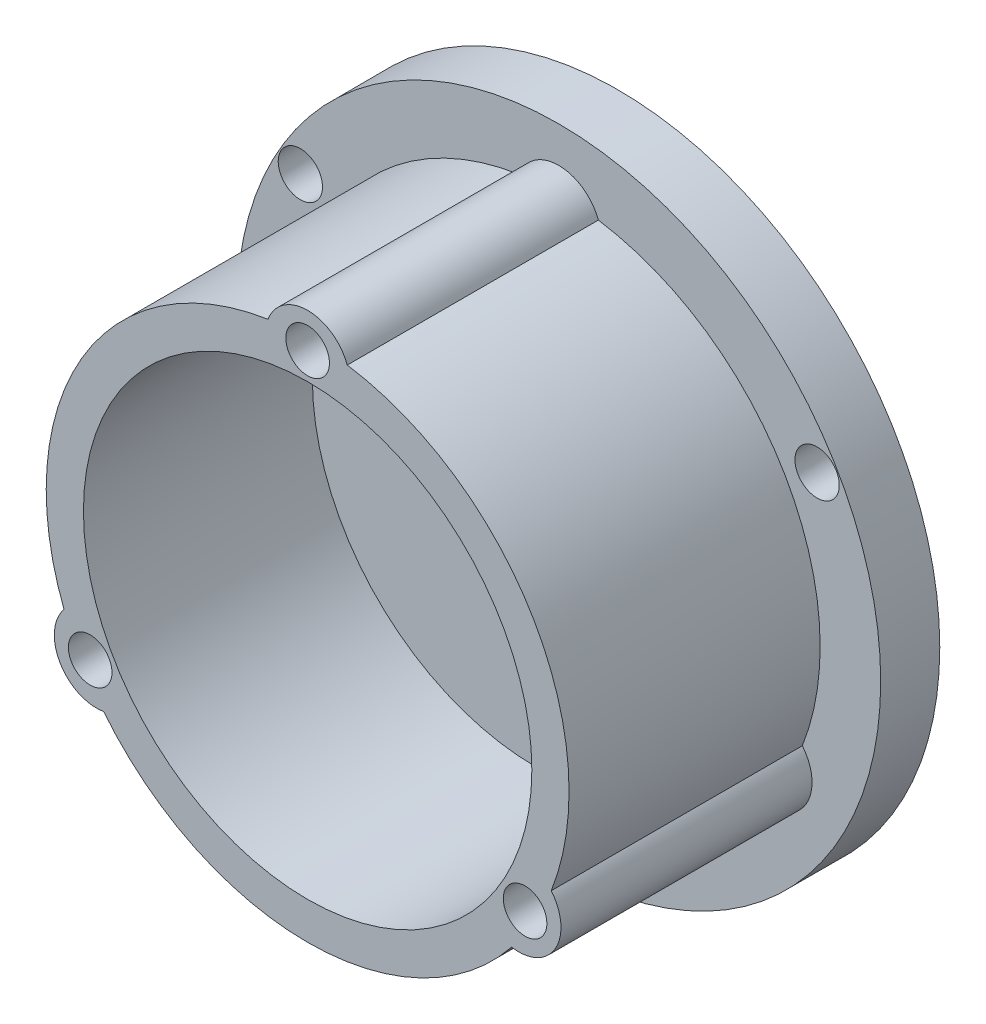
ISO-10303-21;
HEADER;
FILE_DESCRIPTION(('STEP AP214'),'2;1');
FILE_NAME('part.step','',(''),(''),'','','');
FILE_SCHEMA(('AUTOMOTIVE_DESIGN { 1 0 10303 214 1 1 1 1 }'));
ENDSEC;
DATA;
#1=APPLICATION_CONTEXT('core data for automotive mechanical design processes');
#2=APPLICATION_PROTOCOL_DEFINITION('international standard','automotive_design',2000,#1);
#3=PRODUCT_CONTEXT('',#1,'mechanical');
#4=PRODUCT('Part','Part','',(#3));
#5=PRODUCT_RELATED_PRODUCT_CATEGORY('part','',(#4));
#6=PRODUCT_DEFINITION_FORMATION('','',#4);
#7=PRODUCT_DEFINITION_CONTEXT('part definition',#1,'design');
#8=PRODUCT_DEFINITION('design','',#6,#7);
#9=PRODUCT_DEFINITION_SHAPE('','',#8);
#10=(LENGTH_UNIT() NAMED_UNIT(*) SI_UNIT(.MILLI.,.METRE.));
#11=(NAMED_UNIT(*) PLANE_ANGLE_UNIT() SI_UNIT($,.RADIAN.));
#12=(NAMED_UNIT(*) SI_UNIT($,.STERADIAN.) SOLID_ANGLE_UNIT());
#13=UNCERTAINTY_MEASURE_WITH_UNIT(LENGTH_MEASURE(1.E-05),#10,'distance_accuracy_value','');
#14=(GEOMETRIC_REPRESENTATION_CONTEXT(3) GLOBAL_UNCERTAINTY_ASSIGNED_CONTEXT((#13)) GLOBAL_UNIT_ASSIGNED_CONTEXT((#10,
#11,#12)) REPRESENTATION_CONTEXT('',''));
#15=CARTESIAN_POINT('',(0.,0.,0.));
#16=DIRECTION('',(0.,0.,1.));
#17=DIRECTION('',(1.,0.,0.));
#18=AXIS2_PLACEMENT_3D('',#15,#16,#17);
#19=CARTESIAN_POINT('',(-10.3923048454125,5.99999999999957,5.));
#20=DIRECTION('',(0.,0.,1.));
#21=DIRECTION('',(1.,0.,0.));
#22=AXIS2_PLACEMENT_3D('',#19,#20,#21);
#23=PLANE('',#22);
#24=CARTESIAN_POINT('',(-36.373066958945,-41.2000000000007,5.));
#25=DIRECTION('',(0.,0.,-1.));
#26=DIRECTION('',(-1.,0.,0.));
#27=AXIS2_PLACEMENT_3D('',#24,#25,#26);
#28=CIRCLE('',#27,1.5);
#29=CARTESIAN_POINT('',(-37.873066958945,-41.2000000000007,5.));
#30=VERTEX_POINT('',#29);
#31=EDGE_CURVE('E261',#30,#30,#28,.T.);
#32=ORIENTED_EDGE('',*,*,#31,.F.);
#33=EDGE_LOOP('',(#32));
#34=FACE_BOUND('',#33,.T.);
#35=CARTESIAN_POINT('',(-18.8793538024994,-10.9000000000006,5.));
#36=DIRECTION('',(0.,0.,-1.));
#37=DIRECTION('',(-1.,0.,0.));
#38=AXIS2_PLACEMENT_3D('',#35,#36,#37);
#39=CIRCLE('',#38,1.50000000000001);
#40=CARTESIAN_POINT('',(-20.3793538024994,-10.9000000000006,5.));
#41=VERTEX_POINT('',#40);
#42=EDGE_CURVE('E339',#41,#41,#39,.T.);
#43=ORIENTED_EDGE('',*,*,#42,.F.);
#44=EDGE_LOOP('',(#43));
#45=FACE_BOUND('',#44,.T.);
#46=CARTESIAN_POINT('',(-53.8667801153908,-10.9000000000009,5.));
#47=DIRECTION('',(0.,0.,-1.));
#48=DIRECTION('',(-1.,0.,0.));
#49=AXIS2_PLACEMENT_3D('',#46,#47,#48);
#50=CIRCLE('',#49,1.50000000000001);
#51=CARTESIAN_POINT('',(-55.3667801153908,-10.9000000000009,5.));
#52=VERTEX_POINT('',#51);
#53=EDGE_CURVE('E282',#52,#52,#50,.T.);
#54=ORIENTED_EDGE('',*,*,#53,.F.);
#55=EDGE_LOOP('',(#54));
#56=FACE_BOUND('',#55,.T.);
#57=DIRECTION('',(-0.5,0.866025403784439,0.));
#58=VECTOR('',#57,1.);
#59=CARTESIAN_POINT('',(-51.9615242270673,-30.0000000000006,5.));
#60=LINE('',#59,#58);
#61=CARTESIAN_POINT('',(-48.5865242270684,-35.8456714755438,5.));
#62=VERTEX_POINT('',#61);
#63=CARTESIAN_POINT('',(-55.3365242270684,-24.1543285244538,5.));
#64=VERTEX_POINT('',#63);
#65=EDGE_CURVE('E216',#62,#64,#60,.T.);
#66=ORIENTED_EDGE('',*,*,#65,.F.);
#67=DIRECTION('',(-0.866025403784439,-0.5,0.));
#68=VECTOR('',#67,1.);
#69=CARTESIAN_POINT('',(3.37499999999898,-5.84567147554321,5.));
#70=LINE('',#69,#68);
#71=CARTESIAN_POINT('',(-24.3378129211041,-21.8456714755438,5.));
#72=VERTEX_POINT('',#71);
#73=EDGE_CURVE('E72',#72,#62,#70,.T.);
#74=ORIENTED_EDGE('',*,*,#73,.F.);
#75=DIRECTION('',(0.5,-0.866025403784439,0.));
#76=VECTOR('',#75,1.);
#77=CARTESIAN_POINT('',(-27.7128129211031,-16.0000000000006,5.));
#78=LINE('',#77,#76);
#79=CARTESIAN_POINT('',(-31.0878129211041,-10.1543285244538,5.));
#80=VERTEX_POINT('',#79);
#81=EDGE_CURVE('E201',#80,#72,#78,.T.);
#82=ORIENTED_EDGE('',*,*,#81,.F.);
#83=DIRECTION('',(0.866025403784439,0.5,0.));
#84=VECTOR('',#83,1.);
#85=CARTESIAN_POINT('',(-3.37500000000102,5.84567147554674,5.));
#86=LINE('',#85,#84);
#87=EDGE_CURVE('E220',#64,#80,#86,.T.);
#88=ORIENTED_EDGE('',*,*,#87,.F.);
#89=EDGE_LOOP('',(#66,#74,#82,#88));
#90=FACE_BOUND('',#89,.T.);
#91=CARTESIAN_POINT('',(-36.373066958945,-21.0000000000007,5.));
#92=DIRECTION('',(0.,0.,1.));
#93=DIRECTION('',(1.,0.,0.));
#94=AXIS2_PLACEMENT_3D('',#91,#92,#93);
#95=CIRCLE('',#94,21.8);
#96=CARTESIAN_POINT('',(-14.573066958945,-21.0000000000007,5.));
#97=VERTEX_POINT('',#96);
#98=EDGE_CURVE('E173',#97,#97,#95,.F.);
#99=ORIENTED_EDGE('',*,*,#98,.T.);
#100=EDGE_LOOP('',(#99));
#101=FACE_BOUND('',#100,.T.);
#102=ADVANCED_FACE('F47',(#34,#45,#56,#90,#101),#23,.F.);
#103=CARTESIAN_POINT('',(0.,0.,9.));
#104=DIRECTION('',(0.,0.,-1.));
#105=DIRECTION('',(-1.,0.,0.));
#106=AXIS2_PLACEMENT_3D('',#103,#104,#105);
#107=PLANE('',#106);
#108=CARTESIAN_POINT('',(-36.373066958945,-41.2000000000007,9.));
#109=DIRECTION('',(0.,0.,-1.));
#110=DIRECTION('',(-1.,0.,0.));
#111=AXIS2_PLACEMENT_3D('',#108,#109,#110);
#112=CIRCLE('',#111,1.5);
#113=CARTESIAN_POINT('',(-37.873066958945,-41.2000000000007,9.));
#114=VERTEX_POINT('',#113);
#115=EDGE_CURVE('E50',#114,#114,#112,.T.);
#116=ORIENTED_EDGE('',*,*,#115,.T.);
#117=EDGE_LOOP('',(#116));
#118=FACE_BOUND('',#117,.T.);
#119=CARTESIAN_POINT('',(-18.8793538024994,-10.9000000000006,9.));
#120=DIRECTION('',(0.,0.,-1.));
#121=DIRECTION('',(-1.,0.,0.));
#122=AXIS2_PLACEMENT_3D('',#119,#120,#121);
#123=CIRCLE('',#122,1.50000000000001);
#124=CARTESIAN_POINT('',(-20.3793538024994,-10.9000000000006,9.));
#125=VERTEX_POINT('',#124);
#126=EDGE_CURVE('E260',#125,#125,#123,.T.);
#127=ORIENTED_EDGE('',*,*,#126,.T.);
#128=EDGE_LOOP('',(#127));
#129=FACE_BOUND('',#128,.T.);
#130=CARTESIAN_POINT('',(-53.8667801153908,-10.9000000000009,9.));
#131=DIRECTION('',(0.,0.,-1.));
#132=DIRECTION('',(-1.,0.,0.));
#133=AXIS2_PLACEMENT_3D('',#130,#131,#132);
#134=CIRCLE('',#133,1.50000000000001);
#135=CARTESIAN_POINT('',(-55.3667801153908,-10.9000000000009,9.));
#136=VERTEX_POINT('',#135);
#137=EDGE_CURVE('E257',#136,#136,#134,.T.);
#138=ORIENTED_EDGE('',*,*,#137,.T.);
#139=EDGE_LOOP('',(#138));
#140=FACE_BOUND('',#139,.T.);
#141=CARTESIAN_POINT('',(-36.373066958945,-21.0000000000007,9.00000000000001));
#142=DIRECTION('',(0.,0.,-1.));
#143=DIRECTION('',(-1.,0.,0.));
#144=AXIS2_PLACEMENT_3D('',#141,#142,#143);
#145=CIRCLE('',#144,17.6999999999999);
#146=CARTESIAN_POINT('',(-19.8796428478983,-27.4231581868383,9.00000000000001));
#147=VERTEX_POINT('',#146);
#148=CARTESIAN_POINT('',(-33.6889730657505,-3.50469663102446,9.00000000000001));
#149=VERTEX_POINT('',#148);
#150=EDGE_CURVE('E152',#147,#149,#145,.F.);
#151=ORIENTED_EDGE('',*,*,#150,.F.);
#152=CARTESIAN_POINT('',(-22.0836477965023,-29.2499999999995,9.00000000000001));
#153=DIRECTION('',(0.,0.,-1.));
#154=DIRECTION('',(-1.,0.,0.));
#155=AXIS2_PLACEMENT_3D('',#152,#153,#154);
#156=CIRCLE('',#155,2.86268908961222);
#157=CARTESIAN_POINT('',(-22.5637367410934,-32.0721451821377,9.00000000000001));
#158=VERTEX_POINT('',#157);
#159=EDGE_CURVE('E160',#158,#147,#156,.F.);
#160=ORIENTED_EDGE('',*,*,#159,.F.);
#161=CARTESIAN_POINT('',(-36.373066958945,-21.0000000000007,9.00000000000001));
#162=DIRECTION('',(0.,0.,-1.));
#163=DIRECTION('',(-1.,0.,0.));
#164=AXIS2_PLACEMENT_3D('',#161,#162,#163);
#165=CIRCLE('',#164,17.6999999999997);
#166=CARTESIAN_POINT('',(-50.1823971767957,-32.0721451821388,9.00000000000001));
#167=VERTEX_POINT('',#166);
#168=EDGE_CURVE('E165',#167,#158,#165,.F.);
#169=ORIENTED_EDGE('',*,*,#168,.F.);
#170=CARTESIAN_POINT('',(-50.6624861213869,-29.2500000000009,9.00000000000001));
#171=DIRECTION('',(0.,0.,-1.));
#172=DIRECTION('',(-1.,0.,0.));
#173=AXIS2_PLACEMENT_3D('',#170,#171,#172);
#174=CIRCLE('',#173,2.86268908961191);
#175=CARTESIAN_POINT('',(-52.8664910699909,-27.4231581868401,9.00000000000001));
#176=VERTEX_POINT('',#175);
#177=EDGE_CURVE('E145',#176,#167,#174,.F.);
#178=ORIENTED_EDGE('',*,*,#177,.F.);
#179=CARTESIAN_POINT('',(-36.373066958945,-21.0000000000007,9.00000000000001));
#180=DIRECTION('',(0.,0.,-1.));
#181=DIRECTION('',(-1.,0.,0.));
#182=AXIS2_PLACEMENT_3D('',#179,#180,#181);
#183=CIRCLE('',#182,17.6999999999997);
#184=CARTESIAN_POINT('',(-39.0571608521412,-3.50469663102484,9.00000000000001));
#185=VERTEX_POINT('',#184);
#186=EDGE_CURVE('E129',#185,#176,#183,.F.);
#187=ORIENTED_EDGE('',*,*,#186,.F.);
#188=CARTESIAN_POINT('',(-36.3730669589458,-4.50000000000173,9.00000000000001));
#189=DIRECTION('',(0.,0.,-1.));
#190=DIRECTION('',(-1.,0.,0.));
#191=AXIS2_PLACEMENT_3D('',#188,#189,#190);
#192=CIRCLE('',#191,2.86268908961237);
#193=EDGE_CURVE('E142',#149,#185,#192,.F.);
#194=ORIENTED_EDGE('',*,*,#193,.F.);
#195=EDGE_LOOP('',(#151,#160,#169,#178,#187,#194));
#196=FACE_BOUND('',#195,.T.);
#197=CARTESIAN_POINT('',(-36.373066958945,-21.0000000000007,9.));
#198=DIRECTION('',(0.,0.,-1.));
#199=DIRECTION('',(-1.,0.,0.));
#200=AXIS2_PLACEMENT_3D('',#197,#198,#199);
#201=CIRCLE('',#200,21.8);
#202=CARTESIAN_POINT('',(-58.173066958945,-21.0000000000007,9.));
#203=VERTEX_POINT('',#202);
#204=EDGE_CURVE('E279',#203,#203,#201,.T.);
#205=ORIENTED_EDGE('',*,*,#204,.F.);
#206=EDGE_LOOP('',(#205));
#207=FACE_BOUND('',#206,.T.);
#208=ADVANCED_FACE('F140',(#118,#129,#140,#196,#207),#107,.F.);
#209=CARTESIAN_POINT('',(-36.373066958945,-21.0000000000007,26.));
#210=DIRECTION('',(0.,0.,1.));
#211=DIRECTION('',(1.,0.,0.));
#212=AXIS2_PLACEMENT_3D('',#209,#210,#211);
#213=PLANE('',#212);
#214=CARTESIAN_POINT('',(-21.6506350946094,-29.5000000000009,26.));
#215=DIRECTION('',(0.,0.,1.));
#216=DIRECTION('',(1.,0.,0.));
#217=AXIS2_PLACEMENT_3D('',#214,#215,#216);
#218=CIRCLE('',#217,1.47499999999824);
#219=CARTESIAN_POINT('',(-20.1756350946112,-29.5000000000009,26.));
#220=VERTEX_POINT('',#219);
#221=EDGE_CURVE('E230',#220,#220,#218,.T.);
#222=ORIENTED_EDGE('',*,*,#221,.F.);
#223=EDGE_LOOP('',(#222));
#224=FACE_BOUND('',#223,.T.);
#225=CARTESIAN_POINT('',(-36.373066958946,-4.00000000000155,26.));
#226=DIRECTION('',(0.,0.,1.));
#227=DIRECTION('',(1.,0.,0.));
#228=AXIS2_PLACEMENT_3D('',#225,#226,#227);
#229=CIRCLE('',#228,1.4749999999993);
#230=CARTESIAN_POINT('',(-34.8980669589467,-4.00000000000155,26.));
#231=VERTEX_POINT('',#230);
#232=EDGE_CURVE('E243',#231,#231,#229,.T.);
#233=ORIENTED_EDGE('',*,*,#232,.F.);
#234=EDGE_LOOP('',(#233));
#235=FACE_BOUND('',#234,.T.);
#236=CARTESIAN_POINT('',(-51.0954988232803,-29.5000000000022,26.));
#237=DIRECTION('',(0.,0.,1.));
#238=DIRECTION('',(1.,0.,0.));
#239=AXIS2_PLACEMENT_3D('',#236,#237,#238);
#240=CIRCLE('',#239,1.47500000000316);
#241=CARTESIAN_POINT('',(-49.6204988232772,-29.5000000000022,26.));
#242=VERTEX_POINT('',#241);
#243=EDGE_CURVE('E56',#242,#242,#240,.T.);
#244=ORIENTED_EDGE('',*,*,#243,.F.);
#245=EDGE_LOOP('',(#244));
#246=FACE_BOUND('',#245,.T.);
#247=CARTESIAN_POINT('',(-36.373066958945,-21.0000000000007,26.));
#248=DIRECTION('',(0.,0.,1.));
#249=DIRECTION('',(1.,0.,0.));
#250=AXIS2_PLACEMENT_3D('',#247,#248,#249);
#251=CIRCLE('',#250,15.18);
#252=CARTESIAN_POINT('',(-21.193066958945,-21.0000000000007,26.));
#253=VERTEX_POINT('',#252);
#254=EDGE_CURVE('E164',#253,#253,#251,.T.);
#255=ORIENTED_EDGE('',*,*,#254,.F.);
#256=EDGE_LOOP('',(#255));
#257=FACE_BOUND('',#256,.T.);
#258=CARTESIAN_POINT('',(-36.373066958945,-21.0000000000007,26.));
#259=DIRECTION('',(0.,0.,1.));
#260=DIRECTION('',(1.,0.,0.));
#261=AXIS2_PLACEMENT_3D('',#258,#259,#260);
#262=CIRCLE('',#261,17.6999999999999);
#263=CARTESIAN_POINT('',(-19.8796428478983,-27.4231581868383,26.));
#264=VERTEX_POINT('',#263);
#265=CARTESIAN_POINT('',(-33.6889730657505,-3.50469663102446,26.));
#266=VERTEX_POINT('',#265);
#267=EDGE_CURVE('E177',#264,#266,#262,.T.);
#268=ORIENTED_EDGE('',*,*,#267,.T.);
#269=CARTESIAN_POINT('',(-36.3730669589458,-4.50000000000173,26.));
#270=DIRECTION('',(0.,0.,1.));
#271=DIRECTION('',(1.,0.,0.));
#272=AXIS2_PLACEMENT_3D('',#269,#270,#271);
#273=CIRCLE('',#272,2.86268908961237);
#274=CARTESIAN_POINT('',(-39.0571608521412,-3.50469663102484,26.));
#275=VERTEX_POINT('',#274);
#276=EDGE_CURVE('E157',#266,#275,#273,.T.);
#277=ORIENTED_EDGE('',*,*,#276,.T.);
#278=CARTESIAN_POINT('',(-36.373066958945,-21.0000000000007,26.));
#279=DIRECTION('',(0.,0.,1.));
#280=DIRECTION('',(1.,0.,0.));
#281=AXIS2_PLACEMENT_3D('',#278,#279,#280);
#282=CIRCLE('',#281,17.6999999999997);
#283=CARTESIAN_POINT('',(-52.8664910699909,-27.4231581868401,26.));
#284=VERTEX_POINT('',#283);
#285=EDGE_CURVE('E131',#275,#284,#282,.T.);
#286=ORIENTED_EDGE('',*,*,#285,.T.);
#287=CARTESIAN_POINT('',(-50.6624861213869,-29.2500000000009,26.));
#288=DIRECTION('',(0.,0.,1.));
#289=DIRECTION('',(1.,0.,0.));
#290=AXIS2_PLACEMENT_3D('',#287,#288,#289);
#291=CIRCLE('',#290,2.86268908961191);
#292=CARTESIAN_POINT('',(-50.1823971767957,-32.0721451821388,26.));
#293=VERTEX_POINT('',#292);
#294=EDGE_CURVE('E64',#284,#293,#291,.T.);
#295=ORIENTED_EDGE('',*,*,#294,.T.);
#296=CARTESIAN_POINT('',(-36.373066958945,-21.0000000000007,26.));
#297=DIRECTION('',(0.,0.,1.));
#298=DIRECTION('',(1.,0.,0.));
#299=AXIS2_PLACEMENT_3D('',#296,#297,#298);
#300=CIRCLE('',#299,17.6999999999997);
#301=CARTESIAN_POINT('',(-22.5637367410934,-32.0721451821377,26.));
#302=VERTEX_POINT('',#301);
#303=EDGE_CURVE('E185',#293,#302,#300,.T.);
#304=ORIENTED_EDGE('',*,*,#303,.T.);
#305=CARTESIAN_POINT('',(-22.0836477965023,-29.2499999999995,26.));
#306=DIRECTION('',(0.,0.,1.));
#307=DIRECTION('',(1.,0.,0.));
#308=AXIS2_PLACEMENT_3D('',#305,#306,#307);
#309=CIRCLE('',#308,2.86268908961222);
#310=EDGE_CURVE('E181',#302,#264,#309,.T.);
#311=ORIENTED_EDGE('',*,*,#310,.T.);
#312=EDGE_LOOP('',(#268,#277,#286,#295,#304,#311));
#313=FACE_BOUND('',#312,.T.);
#314=ADVANCED_FACE('F303',(#224,#235,#246,#257,#313),#213,.T.);
#315=CARTESIAN_POINT('',(-36.373066958945,-21.0000000000007,10.5));
#316=DIRECTION('',(0.,0.,1.));
#317=DIRECTION('',(1.,0.,0.));
#318=AXIS2_PLACEMENT_3D('',#315,#316,#317);
#319=PLANE('',#318);
#320=CARTESIAN_POINT('',(-36.373066958945,-21.0000000000007,10.5));
#321=DIRECTION('',(0.,0.,1.));
#322=DIRECTION('',(1.,0.,0.));
#323=AXIS2_PLACEMENT_3D('',#320,#321,#322);
#324=CIRCLE('',#323,4.1);
#325=CARTESIAN_POINT('',(-32.273066958945,-21.0000000000007,10.5));
#326=VERTEX_POINT('',#325);
#327=EDGE_CURVE('E273',#326,#326,#324,.T.);
#328=ORIENTED_EDGE('',*,*,#327,.F.);
#329=EDGE_LOOP('',(#328));
#330=FACE_BOUND('',#329,.T.);
#331=CARTESIAN_POINT('',(-36.373066958945,-21.0000000000007,10.5));
#332=DIRECTION('',(0.,0.,1.));
#333=DIRECTION('',(1.,0.,0.));
#334=AXIS2_PLACEMENT_3D('',#331,#332,#333);
#335=CIRCLE('',#334,15.18);
#336=CARTESIAN_POINT('',(-21.193066958945,-21.0000000000007,10.5));
#337=VERTEX_POINT('',#336);
#338=EDGE_CURVE('E192',#337,#337,#335,.F.);
#339=ORIENTED_EDGE('',*,*,#338,.F.);
#340=EDGE_LOOP('',(#339));
#341=FACE_BOUND('',#340,.T.);
#342=ADVANCED_FACE('F420',(#330,#341),#319,.T.);
#343=CARTESIAN_POINT('',(-21.6506350946094,-29.5000000000009,21.));
#344=DIRECTION('',(0.,0.,1.));
#345=DIRECTION('',(1.,0.,0.));
#346=AXIS2_PLACEMENT_3D('',#343,#344,#345);
#347=CYLINDRICAL_SURFACE('',#346,1.47499999999824);
#348=CARTESIAN_POINT('',(-21.6506350946094,-29.5000000000009,21.));
#349=DIRECTION('',(0.,0.,1.));
#350=DIRECTION('',(1.,0.,0.));
#351=AXIS2_PLACEMENT_3D('',#348,#349,#350);
#352=CIRCLE('',#351,1.47499999999824);
#353=CARTESIAN_POINT('',(-20.1756350946112,-29.5000000000009,21.));
#354=VERTEX_POINT('',#353);
#355=EDGE_CURVE('E247',#354,#354,#352,.T.);
#356=ORIENTED_EDGE('',*,*,#355,.F.);
#357=EDGE_LOOP('',(#356));
#358=FACE_BOUND('',#357,.T.);
#359=ORIENTED_EDGE('',*,*,#221,.T.);
#360=EDGE_LOOP('',(#359));
#361=FACE_BOUND('',#360,.T.);
#362=ADVANCED_FACE('F428',(#358,#361),#347,.F.);
#363=CARTESIAN_POINT('',(-21.6506350946094,-29.5000000000009,21.));
#364=DIRECTION('',(0.,0.,1.));
#365=DIRECTION('',(1.,0.,0.));
#366=AXIS2_PLACEMENT_3D('',#363,#364,#365);
#367=PLANE('',#366);
#368=ORIENTED_EDGE('',*,*,#355,.T.);
#369=EDGE_LOOP('',(#368));
#370=FACE_BOUND('',#369,.T.);
#371=ADVANCED_FACE('F436',(#370),#367,.T.);
#372=CARTESIAN_POINT('',(-36.373066958946,-4.00000000000155,21.));
#373=DIRECTION('',(0.,0.,1.));
#374=DIRECTION('',(1.,0.,0.));
#375=AXIS2_PLACEMENT_3D('',#372,#373,#374);
#376=CYLINDRICAL_SURFACE('',#375,1.4749999999993);
#377=CARTESIAN_POINT('',(-36.373066958946,-4.00000000000155,21.));
#378=DIRECTION('',(0.,0.,1.));
#379=DIRECTION('',(1.,0.,0.));
#380=AXIS2_PLACEMENT_3D('',#377,#378,#379);
#381=CIRCLE('',#380,1.4749999999993);
#382=CARTESIAN_POINT('',(-34.8980669589467,-4.00000000000155,21.));
#383=VERTEX_POINT('',#382);
#384=EDGE_CURVE('E239',#383,#383,#381,.T.);
#385=ORIENTED_EDGE('',*,*,#384,.F.);
#386=EDGE_LOOP('',(#385));
#387=FACE_BOUND('',#386,.T.);
#388=ORIENTED_EDGE('',*,*,#232,.T.);
#389=EDGE_LOOP('',(#388));
#390=FACE_BOUND('',#389,.T.);
#391=ADVANCED_FACE('F444',(#387,#390),#376,.F.);
#392=CARTESIAN_POINT('',(-36.373066958946,-4.00000000000155,21.));
#393=DIRECTION('',(0.,0.,1.));
#394=DIRECTION('',(1.,0.,0.));
#395=AXIS2_PLACEMENT_3D('',#392,#393,#394);
#396=PLANE('',#395);
#397=ORIENTED_EDGE('',*,*,#384,.T.);
#398=EDGE_LOOP('',(#397));
#399=FACE_BOUND('',#398,.T.);
#400=ADVANCED_FACE('F452',(#399),#396,.T.);
#401=CARTESIAN_POINT('',(-51.0954988232803,-29.5000000000022,21.));
#402=DIRECTION('',(0.,0.,1.));
#403=DIRECTION('',(1.,0.,0.));
#404=AXIS2_PLACEMENT_3D('',#401,#402,#403);
#405=CYLINDRICAL_SURFACE('',#404,1.47500000000316);
#406=CARTESIAN_POINT('',(-51.0954988232803,-29.5000000000022,21.));
#407=DIRECTION('',(0.,0.,1.));
#408=DIRECTION('',(1.,0.,0.));
#409=AXIS2_PLACEMENT_3D('',#406,#407,#408);
#410=CIRCLE('',#409,1.47500000000316);
#411=CARTESIAN_POINT('',(-49.6204988232772,-29.5000000000022,21.));
#412=VERTEX_POINT('',#411);
#413=EDGE_CURVE('E11',#412,#412,#410,.T.);
#414=ORIENTED_EDGE('',*,*,#413,.F.);
#415=EDGE_LOOP('',(#414));
#416=FACE_BOUND('',#415,.T.);
#417=ORIENTED_EDGE('',*,*,#243,.T.);
#418=EDGE_LOOP('',(#417));
#419=FACE_BOUND('',#418,.T.);
#420=ADVANCED_FACE('F460',(#416,#419),#405,.F.);
#421=CARTESIAN_POINT('',(-51.0954988232803,-29.5000000000022,21.));
#422=DIRECTION('',(0.,0.,1.));
#423=DIRECTION('',(1.,0.,0.));
#424=AXIS2_PLACEMENT_3D('',#421,#422,#423);
#425=PLANE('',#424);
#426=ORIENTED_EDGE('',*,*,#413,.T.);
#427=EDGE_LOOP('',(#426));
#428=FACE_BOUND('',#427,.T.);
#429=ADVANCED_FACE('F468',(#428),#425,.T.);
#430=CARTESIAN_POINT('',(3.37499999999898,-5.84567147554321,7.));
#431=DIRECTION('',(0.5,-0.866025403784439,0.));
#432=DIRECTION('',(0.866025403784439,0.5,0.));
#433=AXIS2_PLACEMENT_3D('',#430,#431,#432);
#434=PLANE('',#433);
#435=ORIENTED_EDGE('',*,*,#73,.T.);
#436=DIRECTION('',(0.,0.,-1.));
#437=VECTOR('',#436,1.);
#438=CARTESIAN_POINT('',(-48.5865242270684,-35.8456714755438,7.));
#439=LINE('',#438,#437);
#440=CARTESIAN_POINT('',(-48.5865242270684,-35.8456714755438,7.));
#441=VERTEX_POINT('',#440);
#442=EDGE_CURVE('E213',#441,#62,#439,.T.);
#443=ORIENTED_EDGE('',*,*,#442,.F.);
#444=DIRECTION('',(-0.866025403784439,-0.5,0.));
#445=VECTOR('',#444,1.);
#446=CARTESIAN_POINT('',(3.37499999999898,-5.84567147554321,7.));
#447=LINE('',#446,#445);
#448=CARTESIAN_POINT('',(-24.3378129211041,-21.8456714755438,7.));
#449=VERTEX_POINT('',#448);
#450=EDGE_CURVE('E196',#449,#441,#447,.T.);
#451=ORIENTED_EDGE('',*,*,#450,.F.);
#452=DIRECTION('',(0.,0.,-1.));
#453=VECTOR('',#452,1.);
#454=CARTESIAN_POINT('',(-24.3378129211041,-21.8456714755438,7.));
#455=LINE('',#454,#453);
#456=EDGE_CURVE('E227',#449,#72,#455,.T.);
#457=ORIENTED_EDGE('',*,*,#456,.T.);
#458=EDGE_LOOP('',(#435,#443,#451,#457));
#459=FACE_BOUND('',#458,.T.);
#460=ADVANCED_FACE('F476',(#459),#434,.F.);
#461=CARTESIAN_POINT('',(-27.7128129211031,-16.0000000000006,7.));
#462=DIRECTION('',(0.866025403784438,0.5,0.));
#463=DIRECTION('',(-0.5,0.866025403784439,0.));
#464=AXIS2_PLACEMENT_3D('',#461,#462,#463);
#465=PLANE('',#464);
#466=ORIENTED_EDGE('',*,*,#81,.T.);
#467=ORIENTED_EDGE('',*,*,#456,.F.);
#468=DIRECTION('',(0.5,-0.866025403784439,0.));
#469=VECTOR('',#468,1.);
#470=CARTESIAN_POINT('',(-27.7128129211031,-16.0000000000006,7.));
#471=LINE('',#470,#469);
#472=CARTESIAN_POINT('',(-31.0878129211041,-10.1543285244538,7.));
#473=VERTEX_POINT('',#472);
#474=EDGE_CURVE('E209',#473,#449,#471,.T.);
#475=ORIENTED_EDGE('',*,*,#474,.F.);
#476=DIRECTION('',(0.,0.,-1.));
#477=VECTOR('',#476,1.);
#478=CARTESIAN_POINT('',(-31.0878129211041,-10.1543285244538,7.));
#479=LINE('',#478,#477);
#480=EDGE_CURVE('E231',#473,#80,#479,.T.);
#481=ORIENTED_EDGE('',*,*,#480,.T.);
#482=EDGE_LOOP('',(#466,#467,#475,#481));
#483=FACE_BOUND('',#482,.T.);
#484=ADVANCED_FACE('F484',(#483),#465,.F.);
#485=CARTESIAN_POINT('',(-3.37500000000102,5.84567147554674,7.));
#486=DIRECTION('',(-0.5,0.866025403784439,0.));
#487=DIRECTION('',(-0.866025403784439,-0.5,0.));
#488=AXIS2_PLACEMENT_3D('',#485,#486,#487);
#489=PLANE('',#488);
#490=ORIENTED_EDGE('',*,*,#87,.T.);
#491=ORIENTED_EDGE('',*,*,#480,.F.);
#492=DIRECTION('',(0.866025403784439,0.5,0.));
#493=VECTOR('',#492,1.);
#494=CARTESIAN_POINT('',(-3.37500000000102,5.84567147554674,7.));
#495=LINE('',#494,#493);
#496=CARTESIAN_POINT('',(-55.3365242270684,-24.1543285244538,7.));
#497=VERTEX_POINT('',#496);
#498=EDGE_CURVE('E205',#497,#473,#495,.T.);
#499=ORIENTED_EDGE('',*,*,#498,.F.);
#500=DIRECTION('',(0.,0.,-1.));
#501=VECTOR('',#500,1.);
#502=CARTESIAN_POINT('',(-55.3365242270684,-24.1543285244538,7.));
#503=LINE('',#502,#501);
#504=EDGE_CURVE('E234',#497,#64,#503,.T.);
#505=ORIENTED_EDGE('',*,*,#504,.T.);
#506=EDGE_LOOP('',(#490,#491,#499,#505));
#507=FACE_BOUND('',#506,.T.);
#508=ADVANCED_FACE('F491',(#507),#489,.F.);
#509=CARTESIAN_POINT('',(-51.9615242270673,-30.0000000000006,7.));
#510=DIRECTION('',(-0.866025403784439,-0.5,0.));
#511=DIRECTION('',(0.5,-0.866025403784439,0.));
#512=AXIS2_PLACEMENT_3D('',#509,#510,#511);
#513=PLANE('',#512);
#514=ORIENTED_EDGE('',*,*,#65,.T.);
#515=ORIENTED_EDGE('',*,*,#504,.F.);
#516=DIRECTION('',(-0.5,0.866025403784439,0.));
#517=VECTOR('',#516,1.);
#518=CARTESIAN_POINT('',(-51.9615242270673,-30.0000000000006,7.));
#519=LINE('',#518,#517);
#520=EDGE_CURVE('E200',#441,#497,#519,.T.);
#521=ORIENTED_EDGE('',*,*,#520,.F.);
#522=ORIENTED_EDGE('',*,*,#442,.T.);
#523=EDGE_LOOP('',(#514,#515,#521,#522));
#524=FACE_BOUND('',#523,.T.);
#525=ADVANCED_FACE('F499',(#524),#513,.F.);
#526=CARTESIAN_POINT('',(0.,0.,7.));
#527=DIRECTION('',(0.,0.,-1.));
#528=DIRECTION('',(-1.,0.,0.));
#529=AXIS2_PLACEMENT_3D('',#526,#527,#528);
#530=PLANE('',#529);
#531=CARTESIAN_POINT('',(-36.373066958945,-21.0000000000007,7.));
#532=DIRECTION('',(0.,0.,-1.));
#533=DIRECTION('',(-1.,0.,0.));
#534=AXIS2_PLACEMENT_3D('',#531,#532,#533);
#535=CIRCLE('',#534,4.1);
#536=CARTESIAN_POINT('',(-40.473066958945,-21.0000000000007,7.));
#537=VERTEX_POINT('',#536);
#538=EDGE_CURVE('E268',#537,#537,#535,.T.);
#539=ORIENTED_EDGE('',*,*,#538,.F.);
#540=EDGE_LOOP('',(#539));
#541=FACE_BOUND('',#540,.T.);
#542=ORIENTED_EDGE('',*,*,#450,.T.);
#543=ORIENTED_EDGE('',*,*,#520,.T.);
#544=ORIENTED_EDGE('',*,*,#498,.T.);
#545=ORIENTED_EDGE('',*,*,#474,.T.);
#546=EDGE_LOOP('',(#542,#543,#544,#545));
#547=FACE_BOUND('',#546,.T.);
#548=ADVANCED_FACE('F399',(#541,#547),#530,.T.);
#549=CARTESIAN_POINT('',(-36.373066958945,-21.0000000000007,-32.6335136523794));
#550=DIRECTION('',(0.,0.,1.));
#551=DIRECTION('',(1.,0.,0.));
#552=AXIS2_PLACEMENT_3D('',#549,#550,#551);
#553=CYLINDRICAL_SURFACE('',#552,15.18);
#554=ORIENTED_EDGE('',*,*,#338,.T.);
#555=EDGE_LOOP('',(#554));
#556=FACE_BOUND('',#555,.T.);
#557=ORIENTED_EDGE('',*,*,#254,.T.);
#558=EDGE_LOOP('',(#557));
#559=FACE_BOUND('',#558,.T.);
#560=ADVANCED_FACE('F512',(#556,#559),#553,.F.);
#561=CARTESIAN_POINT('',(-36.3730669589458,-4.50000000000173,-304.206743695626));
#562=DIRECTION('',(0.,0.,1.));
#563=DIRECTION('',(1.,0.,0.));
#564=AXIS2_PLACEMENT_3D('',#561,#562,#563);
#565=CYLINDRICAL_SURFACE('',#564,2.86268908961237);
#566=ORIENTED_EDGE('',*,*,#193,.T.);
#567=DIRECTION('',(0.,0.,1.));
#568=VECTOR('',#567,1.);
#569=CARTESIAN_POINT('',(-39.0571608521412,-3.50469663102484,-304.206743695626));
#570=LINE('',#569,#568);
#571=EDGE_CURVE('E126',#185,#275,#570,.T.);
#572=ORIENTED_EDGE('',*,*,#571,.T.);
#573=ORIENTED_EDGE('',*,*,#276,.F.);
#574=DIRECTION('',(0.,0.,1.));
#575=VECTOR('',#574,1.);
#576=CARTESIAN_POINT('',(-33.6889730657505,-3.50469663102446,-304.206743695626));
#577=LINE('',#576,#575);
#578=EDGE_CURVE('E149',#149,#266,#577,.T.);
#579=ORIENTED_EDGE('',*,*,#578,.F.);
#580=EDGE_LOOP('',(#566,#572,#573,#579));
#581=FACE_BOUND('',#580,.T.);
#582=ADVANCED_FACE('F148',(#581),#565,.T.);
#583=CARTESIAN_POINT('',(-36.373066958945,-21.0000000000007,-304.206743695626));
#584=DIRECTION('',(0.,0.,1.));
#585=DIRECTION('',(1.,0.,0.));
#586=AXIS2_PLACEMENT_3D('',#583,#584,#585);
#587=CYLINDRICAL_SURFACE('',#586,17.6999999999999);
#588=ORIENTED_EDGE('',*,*,#150,.T.);
#589=ORIENTED_EDGE('',*,*,#578,.T.);
#590=ORIENTED_EDGE('',*,*,#267,.F.);
#591=DIRECTION('',(0.,0.,1.));
#592=VECTOR('',#591,1.);
#593=CARTESIAN_POINT('',(-19.8796428478983,-27.4231581868383,-304.206743695626));
#594=LINE('',#593,#592);
#595=EDGE_CURVE('E174',#147,#264,#594,.T.);
#596=ORIENTED_EDGE('',*,*,#595,.F.);
#597=EDGE_LOOP('',(#588,#589,#590,#596));
#598=FACE_BOUND('',#597,.T.);
#599=ADVANCED_FACE('F309',(#598),#587,.T.);
#600=CARTESIAN_POINT('',(-22.0836477965023,-29.2499999999995,-304.206743695626));
#601=DIRECTION('',(0.,0.,1.));
#602=DIRECTION('',(1.,0.,0.));
#603=AXIS2_PLACEMENT_3D('',#600,#601,#602);
#604=CYLINDRICAL_SURFACE('',#603,2.86268908961222);
#605=ORIENTED_EDGE('',*,*,#159,.T.);
#606=ORIENTED_EDGE('',*,*,#595,.T.);
#607=ORIENTED_EDGE('',*,*,#310,.F.);
#608=DIRECTION('',(0.,0.,1.));
#609=VECTOR('',#608,1.);
#610=CARTESIAN_POINT('',(-22.5637367410934,-32.0721451821377,-304.206743695626));
#611=LINE('',#610,#609);
#612=EDGE_CURVE('E178',#158,#302,#611,.T.);
#613=ORIENTED_EDGE('',*,*,#612,.F.);
#614=EDGE_LOOP('',(#605,#606,#607,#613));
#615=FACE_BOUND('',#614,.T.);
#616=ADVANCED_FACE('F313',(#615),#604,.T.);
#617=CARTESIAN_POINT('',(-36.373066958945,-21.0000000000007,-304.206743695626));
#618=DIRECTION('',(0.,0.,1.));
#619=DIRECTION('',(1.,0.,0.));
#620=AXIS2_PLACEMENT_3D('',#617,#618,#619);
#621=CYLINDRICAL_SURFACE('',#620,17.6999999999997);
#622=ORIENTED_EDGE('',*,*,#168,.T.);
#623=ORIENTED_EDGE('',*,*,#612,.T.);
#624=ORIENTED_EDGE('',*,*,#303,.F.);
#625=DIRECTION('',(0.,0.,1.));
#626=VECTOR('',#625,1.);
#627=CARTESIAN_POINT('',(-50.1823971767957,-32.0721451821388,-304.206743695626));
#628=LINE('',#627,#626);
#629=EDGE_CURVE('E182',#167,#293,#628,.T.);
#630=ORIENTED_EDGE('',*,*,#629,.F.);
#631=EDGE_LOOP('',(#622,#623,#624,#630));
#632=FACE_BOUND('',#631,.T.);
#633=ADVANCED_FACE('F316',(#632),#621,.T.);
#634=CARTESIAN_POINT('',(-50.6624861213869,-29.2500000000009,-304.206743695626));
#635=DIRECTION('',(0.,0.,1.));
#636=DIRECTION('',(1.,0.,0.));
#637=AXIS2_PLACEMENT_3D('',#634,#635,#636);
#638=CYLINDRICAL_SURFACE('',#637,2.86268908961191);
#639=ORIENTED_EDGE('',*,*,#177,.T.);
#640=ORIENTED_EDGE('',*,*,#629,.T.);
#641=ORIENTED_EDGE('',*,*,#294,.F.);
#642=DIRECTION('',(0.,0.,1.));
#643=VECTOR('',#642,1.);
#644=CARTESIAN_POINT('',(-52.8664910699909,-27.4231581868401,-304.206743695626));
#645=LINE('',#644,#643);
#646=EDGE_CURVE('E186',#176,#284,#645,.T.);
#647=ORIENTED_EDGE('',*,*,#646,.F.);
#648=EDGE_LOOP('',(#639,#640,#641,#647));
#649=FACE_BOUND('',#648,.T.);
#650=ADVANCED_FACE('F317',(#649),#638,.T.);
#651=CARTESIAN_POINT('',(-36.373066958945,-21.0000000000007,-304.206743695626));
#652=DIRECTION('',(0.,0.,1.));
#653=DIRECTION('',(1.,0.,0.));
#654=AXIS2_PLACEMENT_3D('',#651,#652,#653);
#655=CYLINDRICAL_SURFACE('',#654,17.6999999999997);
#656=ORIENTED_EDGE('',*,*,#186,.T.);
#657=ORIENTED_EDGE('',*,*,#646,.T.);
#658=ORIENTED_EDGE('',*,*,#285,.F.);
#659=ORIENTED_EDGE('',*,*,#571,.F.);
#660=EDGE_LOOP('',(#656,#657,#658,#659));
#661=FACE_BOUND('',#660,.T.);
#662=ADVANCED_FACE('F128',(#661),#655,.T.);
#663=CARTESIAN_POINT('',(-36.373066958945,-21.0000000000007,-362.529291363433));
#664=DIRECTION('',(0.,0.,1.));
#665=DIRECTION('',(1.,0.,0.));
#666=AXIS2_PLACEMENT_3D('',#663,#664,#665);
#667=CYLINDRICAL_SURFACE('',#666,21.8);
#668=ORIENTED_EDGE('',*,*,#204,.T.);
#669=EDGE_LOOP('',(#668));
#670=FACE_BOUND('',#669,.T.);
#671=ORIENTED_EDGE('',*,*,#98,.F.);
#672=EDGE_LOOP('',(#671));
#673=FACE_BOUND('',#672,.T.);
#674=ADVANCED_FACE('F324',(#670,#673),#667,.T.);
#675=CARTESIAN_POINT('',(-36.373066958945,-21.0000000000007,17.));
#676=DIRECTION('',(0.,0.,-1.));
#677=DIRECTION('',(-1.,0.,0.));
#678=AXIS2_PLACEMENT_3D('',#675,#676,#677);
#679=CYLINDRICAL_SURFACE('',#678,4.1);
#680=ORIENTED_EDGE('',*,*,#327,.T.);
#681=EDGE_LOOP('',(#680));
#682=FACE_BOUND('',#681,.T.);
#683=ORIENTED_EDGE('',*,*,#538,.T.);
#684=EDGE_LOOP('',(#683));
#685=FACE_BOUND('',#684,.T.);
#686=ADVANCED_FACE('F349',(#682,#685),#679,.F.);
#687=CARTESIAN_POINT('',(-53.8667801153908,-10.9000000000009,15.));
#688=DIRECTION('',(0.,0.,-1.));
#689=DIRECTION('',(-1.,0.,0.));
#690=AXIS2_PLACEMENT_3D('',#687,#688,#689);
#691=CYLINDRICAL_SURFACE('',#690,1.50000000000001);
#692=ORIENTED_EDGE('',*,*,#53,.T.);
#693=EDGE_LOOP('',(#692));
#694=FACE_BOUND('',#693,.T.);
#695=ORIENTED_EDGE('',*,*,#137,.F.);
#696=EDGE_LOOP('',(#695));
#697=FACE_BOUND('',#696,.T.);
#698=ADVANCED_FACE('F355',(#694,#697),#691,.F.);
#699=CARTESIAN_POINT('',(-18.8793538024994,-10.9000000000006,15.));
#700=DIRECTION('',(0.,0.,-1.));
#701=DIRECTION('',(-1.,0.,0.));
#702=AXIS2_PLACEMENT_3D('',#699,#700,#701);
#703=CYLINDRICAL_SURFACE('',#702,1.50000000000001);
#704=ORIENTED_EDGE('',*,*,#42,.T.);
#705=EDGE_LOOP('',(#704));
#706=FACE_BOUND('',#705,.T.);
#707=ORIENTED_EDGE('',*,*,#126,.F.);
#708=EDGE_LOOP('',(#707));
#709=FACE_BOUND('',#708,.T.);
#710=ADVANCED_FACE('F361',(#706,#709),#703,.F.);
#711=CARTESIAN_POINT('',(-36.373066958945,-41.2000000000007,15.));
#712=DIRECTION('',(0.,0.,-1.));
#713=DIRECTION('',(-1.,0.,0.));
#714=AXIS2_PLACEMENT_3D('',#711,#712,#713);
#715=CYLINDRICAL_SURFACE('',#714,1.5);
#716=ORIENTED_EDGE('',*,*,#31,.T.);
#717=EDGE_LOOP('',(#716));
#718=FACE_BOUND('',#717,.T.);
#719=ORIENTED_EDGE('',*,*,#115,.F.);
#720=EDGE_LOOP('',(#719));
#721=FACE_BOUND('',#720,.T.);
#722=ADVANCED_FACE('F365',(#718,#721),#715,.F.);
#723=CLOSED_SHELL('',(#102,#208,#314,#342,#362,#371,#391,#400,#420,#429,#460,#484,#508,#525,
#548,#560,#582,#599,#616,#633,#650,#662,#674,#686,#698,#710,#722));
#724=MANIFOLD_SOLID_BREP('B2',#723);
#725=ADVANCED_BREP_SHAPE_REPRESENTATION('',(#18,#724),#14);
#726=SHAPE_DEFINITION_REPRESENTATION(#9,#725);
ENDSEC;
END-ISO-10303-21;
